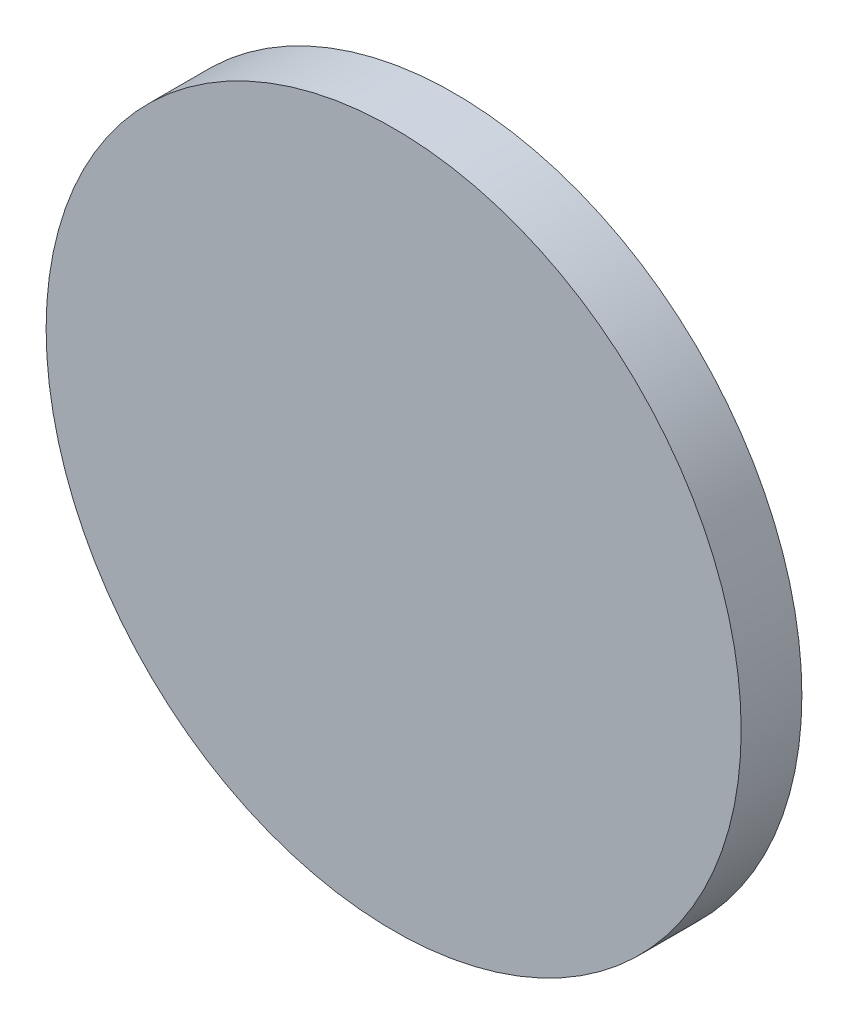
ISO-10303-21;
HEADER;
FILE_DESCRIPTION(('STEP AP214'),'2;1');
FILE_NAME('part.step','',(''),(''),'','','');
FILE_SCHEMA(('AUTOMOTIVE_DESIGN { 1 0 10303 214 1 1 1 1 }'));
ENDSEC;
DATA;
#1=APPLICATION_CONTEXT('core data for automotive mechanical design processes');
#2=APPLICATION_PROTOCOL_DEFINITION('international standard','automotive_design',2000,#1);
#3=PRODUCT_CONTEXT('',#1,'mechanical');
#4=PRODUCT('Part','Part','',(#3));
#5=PRODUCT_RELATED_PRODUCT_CATEGORY('part','',(#4));
#6=PRODUCT_DEFINITION_FORMATION('','',#4);
#7=PRODUCT_DEFINITION_CONTEXT('part definition',#1,'design');
#8=PRODUCT_DEFINITION('design','',#6,#7);
#9=PRODUCT_DEFINITION_SHAPE('','',#8);
#10=(LENGTH_UNIT() NAMED_UNIT(*) SI_UNIT(.MILLI.,.METRE.));
#11=(NAMED_UNIT(*) PLANE_ANGLE_UNIT() SI_UNIT($,.RADIAN.));
#12=(NAMED_UNIT(*) SI_UNIT($,.STERADIAN.) SOLID_ANGLE_UNIT());
#13=UNCERTAINTY_MEASURE_WITH_UNIT(LENGTH_MEASURE(1.E-05),#10,'distance_accuracy_value','');
#14=(GEOMETRIC_REPRESENTATION_CONTEXT(3) GLOBAL_UNCERTAINTY_ASSIGNED_CONTEXT((#13)) GLOBAL_UNIT_ASSIGNED_CONTEXT((#10,
#11,#12)) REPRESENTATION_CONTEXT('',''));
#15=CARTESIAN_POINT('',(0.,0.,0.));
#16=DIRECTION('',(0.,0.,1.));
#17=DIRECTION('',(1.,0.,0.));
#18=AXIS2_PLACEMENT_3D('',#15,#16,#17);
#19=CARTESIAN_POINT('',(0.,0.,2.));
#20=DIRECTION('',(0.,0.,-1.));
#21=DIRECTION('',(-1.,0.,0.));
#22=AXIS2_PLACEMENT_3D('',#19,#20,#21);
#23=CYLINDRICAL_SURFACE('',#22,11.45);
#24=CARTESIAN_POINT('',(0.,0.,2.));
#25=DIRECTION('',(0.,0.,1.));
#26=DIRECTION('',(1.,0.,0.));
#27=AXIS2_PLACEMENT_3D('',#24,#25,#26);
#28=CIRCLE('',#27,11.45);
#29=CARTESIAN_POINT('',(11.45,0.,2.));
#30=VERTEX_POINT('',#29);
#31=EDGE_CURVE('E10',#30,#30,#28,.T.);
#32=ORIENTED_EDGE('',*,*,#31,.F.);
#33=EDGE_LOOP('',(#32));
#34=FACE_BOUND('',#33,.T.);
#35=CARTESIAN_POINT('',(0.,0.,0.));
#36=DIRECTION('',(0.,0.,1.));
#37=DIRECTION('',(1.,0.,0.));
#38=AXIS2_PLACEMENT_3D('',#35,#36,#37);
#39=CIRCLE('',#38,11.45);
#40=CARTESIAN_POINT('',(11.45,0.,0.));
#41=VERTEX_POINT('',#40);
#42=EDGE_CURVE('E34',#41,#41,#39,.T.);
#43=ORIENTED_EDGE('',*,*,#42,.T.);
#44=EDGE_LOOP('',(#43));
#45=FACE_BOUND('',#44,.T.);
#46=ADVANCED_FACE('F31',(#34,#45),#23,.T.);
#47=CARTESIAN_POINT('',(0.,0.,2.));
#48=DIRECTION('',(0.,0.,1.));
#49=DIRECTION('',(1.,0.,0.));
#50=AXIS2_PLACEMENT_3D('',#47,#48,#49);
#51=PLANE('',#50);
#52=ORIENTED_EDGE('',*,*,#31,.T.);
#53=EDGE_LOOP('',(#52));
#54=FACE_BOUND('',#53,.T.);
#55=ADVANCED_FACE('F46',(#54),#51,.T.);
#56=CARTESIAN_POINT('',(0.,0.,0.));
#57=DIRECTION('',(0.,0.,1.));
#58=DIRECTION('',(1.,0.,0.));
#59=AXIS2_PLACEMENT_3D('',#56,#57,#58);
#60=PLANE('',#59);
#61=ORIENTED_EDGE('',*,*,#42,.F.);
#62=EDGE_LOOP('',(#61));
#63=FACE_BOUND('',#62,.T.);
#64=ADVANCED_FACE('F44',(#63),#60,.F.);
#65=CLOSED_SHELL('',(#46,#55,#64));
#66=MANIFOLD_SOLID_BREP('B2',#65);
#67=ADVANCED_BREP_SHAPE_REPRESENTATION('',(#18,#66),#14);
#68=SHAPE_DEFINITION_REPRESENTATION(#9,#67);
ENDSEC;
END-ISO-10303-21;
